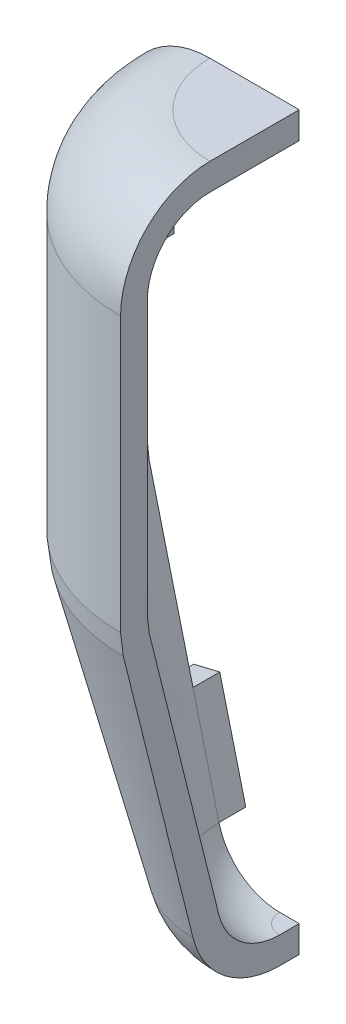
ISO-10303-21;
HEADER;
FILE_DESCRIPTION(('STEP AP214'),'2;1');
FILE_NAME('part.step','',(''),(''),'','','');
FILE_SCHEMA(('AUTOMOTIVE_DESIGN { 1 0 10303 214 1 1 1 1 }'));
ENDSEC;
DATA;
#1=APPLICATION_CONTEXT('core data for automotive mechanical design processes');
#2=APPLICATION_PROTOCOL_DEFINITION('international standard','automotive_design',2000,#1);
#3=PRODUCT_CONTEXT('',#1,'mechanical');
#4=PRODUCT('Part','Part','',(#3));
#5=PRODUCT_RELATED_PRODUCT_CATEGORY('part','',(#4));
#6=PRODUCT_DEFINITION_FORMATION('','',#4);
#7=PRODUCT_DEFINITION_CONTEXT('part definition',#1,'design');
#8=PRODUCT_DEFINITION('design','',#6,#7);
#9=PRODUCT_DEFINITION_SHAPE('','',#8);
#10=(LENGTH_UNIT() NAMED_UNIT(*) SI_UNIT(.MILLI.,.METRE.));
#11=(NAMED_UNIT(*) PLANE_ANGLE_UNIT() SI_UNIT($,.RADIAN.));
#12=(NAMED_UNIT(*) SI_UNIT($,.STERADIAN.) SOLID_ANGLE_UNIT());
#13=UNCERTAINTY_MEASURE_WITH_UNIT(LENGTH_MEASURE(1.E-05),#10,'distance_accuracy_value','');
#14=(GEOMETRIC_REPRESENTATION_CONTEXT(3) GLOBAL_UNCERTAINTY_ASSIGNED_CONTEXT((#13)) GLOBAL_UNIT_ASSIGNED_CONTEXT((#10,
#11,#12)) REPRESENTATION_CONTEXT('',''));
#15=CARTESIAN_POINT('',(0.,0.,0.));
#16=DIRECTION('',(0.,0.,1.));
#17=DIRECTION('',(1.,0.,0.));
#18=AXIS2_PLACEMENT_3D('',#15,#16,#17);
#19=CARTESIAN_POINT('',(-53.9,30.95,0.));
#20=DIRECTION('',(0.,0.,1.));
#21=DIRECTION('',(1.,0.,0.));
#22=AXIS2_PLACEMENT_3D('',#19,#20,#21);
#23=PLANE('',#22);
#24=DIRECTION('',(-1.,0.,0.));
#25=VECTOR('',#24,1.);
#26=CARTESIAN_POINT('',(0.,18.95,0.));
#27=LINE('',#26,#25);
#28=CARTESIAN_POINT('',(-60.9,18.95,0.));
#29=VERTEX_POINT('',#28);
#30=CARTESIAN_POINT('',(-63.9,18.95,0.));
#31=VERTEX_POINT('',#30);
#32=EDGE_CURVE('E181',#29,#31,#27,.T.);
#33=ORIENTED_EDGE('',*,*,#32,.F.);
#34=DIRECTION('',(0.,1.,0.));
#35=VECTOR('',#34,1.);
#36=CARTESIAN_POINT('',(-60.9,30.9500000000001,0.));
#37=LINE('',#36,#35);
#38=CARTESIAN_POINT('',(-60.9,0.281056256176644,0.));
#39=VERTEX_POINT('',#38);
#40=EDGE_CURVE('E281',#39,#29,#37,.T.);
#41=ORIENTED_EDGE('',*,*,#40,.F.);
#42=DIRECTION('',(-0.12218326369579,0.992507556682893,0.));
#43=VECTOR('',#42,1.);
#44=CARTESIAN_POINT('',(-60.9,0.281056256176644,0.));
#45=LINE('',#44,#43);
#46=CARTESIAN_POINT('',(-60.6909975010172,-1.41669311907765,0.));
#47=VERTEX_POINT('',#46);
#48=EDGE_CURVE('E279',#47,#39,#45,.T.);
#49=ORIENTED_EDGE('',*,*,#48,.F.);
#50=DIRECTION('',(-0.242535625036333,0.970142500145332,0.));
#51=VECTOR('',#50,1.);
#52=CARTESIAN_POINT('',(-52.883233436973,-32.6477493752543,0.));
#53=LINE('',#52,#51);
#54=CARTESIAN_POINT('',(-55.7936609374092,-21.0060393735097,0.));
#55=VERTEX_POINT('',#54);
#56=EDGE_CURVE('E275',#55,#47,#53,.T.);
#57=ORIENTED_EDGE('',*,*,#56,.F.);
#58=DIRECTION('',(-0.972615925793551,-0.232418288636575,0.));
#59=VECTOR('',#58,1.);
#60=CARTESIAN_POINT('',(1.73461699866961,-7.25896455031711,0.));
#61=LINE('',#60,#59);
#62=CARTESIAN_POINT('',(-58.7116669850018,-21.7033320599926,0.));
#63=VERTEX_POINT('',#62);
#64=EDGE_CURVE('E216',#55,#63,#61,.T.);
#65=ORIENTED_EDGE('',*,*,#64,.T.);
#66=DIRECTION('',(0.242535625036333,-0.970142500145332,0.));
#67=VECTOR('',#66,1.);
#68=CARTESIAN_POINT('',(-55.7936609374092,-33.3753562503633,0.));
#69=LINE('',#68,#67);
#70=CARTESIAN_POINT('',(-63.6014250014533,-2.14429999418669,0.));
#71=VERTEX_POINT('',#70);
#72=EDGE_CURVE('E260',#71,#63,#69,.T.);
#73=ORIENTED_EDGE('',*,*,#72,.F.);
#74=DIRECTION('',(0.122183263695706,-0.992507556682903,0.));
#75=VECTOR('',#74,1.);
#76=CARTESIAN_POINT('',(-63.6014250014533,-2.14429999418669,0.));
#77=LINE('',#76,#75);
#78=CARTESIAN_POINT('',(-63.9,0.281056256176644,0.));
#79=VERTEX_POINT('',#78);
#80=EDGE_CURVE('E257',#79,#71,#77,.T.);
#81=ORIENTED_EDGE('',*,*,#80,.F.);
#82=DIRECTION('',(0.,-1.,0.));
#83=VECTOR('',#82,1.);
#84=CARTESIAN_POINT('',(-63.9,0.281056256176644,0.));
#85=LINE('',#84,#83);
#86=EDGE_CURVE('E253',#31,#79,#85,.T.);
#87=ORIENTED_EDGE('',*,*,#86,.F.);
#88=EDGE_LOOP('',(#33,#41,#49,#57,#65,#73,#81,#87));
#89=FACE_BOUND('',#88,.T.);
#90=ADVANCED_FACE('F36',(#89),#23,.F.);
#91=CARTESIAN_POINT('',(-53.9,30.95,0.));
#92=DIRECTION('',(0.,0.,-1.));
#93=DIRECTION('',(1.,0.,0.));
#94=AXIS2_PLACEMENT_3D('',#91,#92,#93);
#95=CIRCLE('',#94,7.);
#96=CARTESIAN_POINT('',(-60.9,30.9500000000001,0.));
#97=VERTEX_POINT('',#96);
#98=CARTESIAN_POINT('',(-53.8999999999999,37.95,0.));
#99=VERTEX_POINT('',#98);
#100=EDGE_CURVE('E236',#97,#99,#95,.T.);
#101=ORIENTED_EDGE('',*,*,#100,.F.);
#102=DIRECTION('',(-1.,0.,0.));
#103=VECTOR('',#102,1.);
#104=CARTESIAN_POINT('',(0.,30.9499999999999,0.));
#105=LINE('',#104,#103);
#106=CARTESIAN_POINT('',(-63.9,30.95,0.));
#107=VERTEX_POINT('',#106);
#108=EDGE_CURVE('E185',#97,#107,#105,.T.);
#109=ORIENTED_EDGE('',*,*,#108,.T.);
#110=CARTESIAN_POINT('',(-53.9,30.95,0.));
#111=DIRECTION('',(0.,0.,1.));
#112=DIRECTION('',(-1.,0.,0.));
#113=AXIS2_PLACEMENT_3D('',#110,#111,#112);
#114=CIRCLE('',#113,10.);
#115=CARTESIAN_POINT('',(-53.9,40.95,0.));
#116=VERTEX_POINT('',#115);
#117=EDGE_CURVE('E250',#116,#107,#114,.T.);
#118=ORIENTED_EDGE('',*,*,#117,.F.);
#119=DIRECTION('',(-1.,0.,0.));
#120=VECTOR('',#119,1.);
#121=CARTESIAN_POINT('',(-53.9,40.95,0.));
#122=LINE('',#121,#120);
#123=CARTESIAN_POINT('',(-43.9,40.95,0.));
#124=VERTEX_POINT('',#123);
#125=EDGE_CURVE('E247',#124,#116,#122,.T.);
#126=ORIENTED_EDGE('',*,*,#125,.F.);
#127=DIRECTION('',(0.,1.,0.));
#128=VECTOR('',#127,1.);
#129=CARTESIAN_POINT('',(-43.9,40.95,0.));
#130=LINE('',#129,#128);
#131=CARTESIAN_POINT('',(-43.9,37.95,0.));
#132=VERTEX_POINT('',#131);
#133=EDGE_CURVE('E290',#132,#124,#130,.T.);
#134=ORIENTED_EDGE('',*,*,#133,.F.);
#135=DIRECTION('',(1.,0.,0.));
#136=VECTOR('',#135,1.);
#137=CARTESIAN_POINT('',(-43.9,37.95,0.));
#138=LINE('',#137,#136);
#139=EDGE_CURVE('E244',#99,#132,#138,.T.);
#140=ORIENTED_EDGE('',*,*,#139,.F.);
#141=EDGE_LOOP('',(#101,#109,#118,#126,#134,#140));
#142=FACE_BOUND('',#141,.T.);
#143=ADVANCED_FACE('F362',(#142),#23,.F.);
#144=CARTESIAN_POINT('',(-43.9,30.95,0.));
#145=DIRECTION('',(0.,-1.,0.));
#146=DIRECTION('',(0.,0.,-1.));
#147=AXIS2_PLACEMENT_3D('',#144,#145,#146);
#148=TOROIDAL_SURFACE('',#147,10.,7.);
#149=CARTESIAN_POINT('',(-43.9,37.95,0.));
#150=DIRECTION('',(0.,-1.,0.));
#151=DIRECTION('',(0.,0.,-1.));
#152=AXIS2_PLACEMENT_3D('',#149,#150,#151);
#153=CIRCLE('',#152,9.9999999999999);
#154=CARTESIAN_POINT('',(-43.9,37.95,9.9999999999999));
#155=VERTEX_POINT('',#154);
#156=EDGE_CURVE('E11',#155,#99,#153,.T.);
#157=ORIENTED_EDGE('',*,*,#156,.F.);
#158=CARTESIAN_POINT('',(-43.9,30.95,10.));
#159=DIRECTION('',(-1.,0.,0.));
#160=DIRECTION('',(0.,0.,-1.));
#161=AXIS2_PLACEMENT_3D('',#158,#159,#160);
#162=CIRCLE('',#161,7.);
#163=CARTESIAN_POINT('',(-43.8999999999999,30.9500000000001,17.));
#164=VERTEX_POINT('',#163);
#165=EDGE_CURVE('E284',#164,#155,#162,.T.);
#166=ORIENTED_EDGE('',*,*,#165,.F.);
#167=CARTESIAN_POINT('',(-43.9,30.9500000000001,0.));
#168=DIRECTION('',(0.,-1.,0.));
#169=DIRECTION('',(0.,0.,-1.));
#170=AXIS2_PLACEMENT_3D('',#167,#168,#169);
#171=CIRCLE('',#170,17.);
#172=EDGE_CURVE('E51',#164,#97,#171,.T.);
#173=ORIENTED_EDGE('',*,*,#172,.T.);
#174=ORIENTED_EDGE('',*,*,#100,.T.);
#175=EDGE_LOOP('',(#157,#166,#173,#174));
#176=FACE_BOUND('',#175,.T.);
#177=ADVANCED_FACE('F375',(#176),#148,.F.);
#178=CARTESIAN_POINT('',(-43.9,37.95,0.));
#179=DIRECTION('',(0.,1.,0.));
#180=DIRECTION('',(0.,0.,1.));
#181=AXIS2_PLACEMENT_3D('',#178,#179,#180);
#182=PLANE('',#181);
#183=ORIENTED_EDGE('',*,*,#139,.T.);
#184=DIRECTION('',(0.,0.,-1.));
#185=VECTOR('',#184,1.);
#186=CARTESIAN_POINT('',(-43.9,37.95,0.));
#187=LINE('',#186,#185);
#188=EDGE_CURVE('E287',#155,#132,#187,.T.);
#189=ORIENTED_EDGE('',*,*,#188,.F.);
#190=ORIENTED_EDGE('',*,*,#156,.T.);
#191=EDGE_LOOP('',(#183,#189,#190));
#192=FACE_BOUND('',#191,.T.);
#193=ADVANCED_FACE('F38',(#192),#182,.F.);
#194=CARTESIAN_POINT('',(-43.9,40.95,10.));
#195=DIRECTION('',(0.,-1.,0.));
#196=DIRECTION('',(0.,0.,-1.));
#197=AXIS2_PLACEMENT_3D('',#194,#195,#196);
#198=PLANE('',#197);
#199=CARTESIAN_POINT('',(-43.9,40.95,0.));
#200=DIRECTION('',(0.,-1.,0.));
#201=DIRECTION('',(0.,0.,-1.));
#202=AXIS2_PLACEMENT_3D('',#199,#200,#201);
#203=CIRCLE('',#202,10.);
#204=CARTESIAN_POINT('',(-43.9,40.95,10.));
#205=VERTEX_POINT('',#204);
#206=EDGE_CURVE('E44',#205,#116,#203,.T.);
#207=ORIENTED_EDGE('',*,*,#206,.F.);
#208=DIRECTION('',(0.,0.,1.));
#209=VECTOR('',#208,1.);
#210=CARTESIAN_POINT('',(-43.9,40.95,10.));
#211=LINE('',#210,#209);
#212=EDGE_CURVE('E293',#124,#205,#211,.T.);
#213=ORIENTED_EDGE('',*,*,#212,.F.);
#214=ORIENTED_EDGE('',*,*,#125,.T.);
#215=EDGE_LOOP('',(#207,#213,#214));
#216=FACE_BOUND('',#215,.T.);
#217=ADVANCED_FACE('F358',(#216),#198,.F.);
#218=CARTESIAN_POINT('',(-43.9,30.95,0.));
#219=DIRECTION('',(0.,-1.,0.));
#220=DIRECTION('',(0.,0.,-1.));
#221=AXIS2_PLACEMENT_3D('',#218,#219,#220);
#222=DEGENERATE_TOROIDAL_SURFACE('',#221,10.,10.,.T.);
#223=CARTESIAN_POINT('',(-43.9,30.9499999999999,0.));
#224=DIRECTION('',(0.,-1.,0.));
#225=DIRECTION('',(0.,0.,-1.));
#226=AXIS2_PLACEMENT_3D('',#223,#224,#225);
#227=CIRCLE('',#226,20.);
#228=CARTESIAN_POINT('',(-43.8999999999999,30.9499999999999,20.));
#229=VERTEX_POINT('',#228);
#230=EDGE_CURVE('E350',#229,#107,#227,.T.);
#231=ORIENTED_EDGE('',*,*,#230,.F.);
#232=CARTESIAN_POINT('',(-43.9,30.95,10.));
#233=DIRECTION('',(1.,0.,0.));
#234=DIRECTION('',(0.,0.,1.));
#235=AXIS2_PLACEMENT_3D('',#232,#233,#234);
#236=CIRCLE('',#235,10.);
#237=EDGE_CURVE('E296',#205,#229,#236,.T.);
#238=ORIENTED_EDGE('',*,*,#237,.F.);
#239=ORIENTED_EDGE('',*,*,#206,.T.);
#240=ORIENTED_EDGE('',*,*,#117,.T.);
#241=EDGE_LOOP('',(#231,#238,#239,#240));
#242=FACE_BOUND('',#241,.T.);
#243=ADVANCED_FACE('F354',(#242),#222,.T.);
#244=CARTESIAN_POINT('',(-43.9,40.95,0.));
#245=DIRECTION('',(0.,-1.,0.));
#246=DIRECTION('',(0.,0.,-1.));
#247=AXIS2_PLACEMENT_3D('',#244,#245,#246);
#248=CYLINDRICAL_SURFACE('',#247,20.);
#249=CARTESIAN_POINT('',(-43.9,0.281056256176644,0.));
#250=DIRECTION('',(0.,-1.,0.));
#251=DIRECTION('',(0.,0.,-1.));
#252=AXIS2_PLACEMENT_3D('',#249,#250,#251);
#253=CIRCLE('',#252,20.);
#254=CARTESIAN_POINT('',(-43.8999999999999,0.281056256176644,20.));
#255=VERTEX_POINT('',#254);
#256=EDGE_CURVE('E347',#255,#79,#253,.T.);
#257=ORIENTED_EDGE('',*,*,#256,.F.);
#258=DIRECTION('',(0.,-1.,0.));
#259=VECTOR('',#258,1.);
#260=CARTESIAN_POINT('',(-43.8999999999999,0.281056256176644,20.));
#261=LINE('',#260,#259);
#262=EDGE_CURVE('E299',#229,#255,#261,.T.);
#263=ORIENTED_EDGE('',*,*,#262,.F.);
#264=ORIENTED_EDGE('',*,*,#230,.T.);
#265=EDGE_CURVE('E254',#107,#31,#85,.T.);
#266=ORIENTED_EDGE('',*,*,#265,.T.);
#267=ORIENTED_EDGE('',*,*,#86,.T.);
#268=EDGE_LOOP('',(#257,#263,#264,#266,#267));
#269=FACE_BOUND('',#268,.T.);
#270=ADVANCED_FACE('F368',(#269),#248,.T.);
#271=CARTESIAN_POINT('',(-43.9,0.281056256176644,0.));
#272=DIRECTION('',(0.,1.,0.));
#273=DIRECTION('',(0.,0.,1.));
#274=AXIS2_PLACEMENT_3D('',#271,#272,#273);
#275=CONICAL_SURFACE('',#274,20.,0.122489331563434);
#276=CARTESIAN_POINT('',(-43.9,-2.14429999418669,0.));
#277=DIRECTION('',(0.,-1.,0.));
#278=DIRECTION('',(0.,0.,-1.));
#279=AXIS2_PLACEMENT_3D('',#276,#277,#278);
#280=CIRCLE('',#279,19.7014250014533);
#281=CARTESIAN_POINT('',(-43.8999999999999,-2.14429999418669,19.7014250014533));
#282=VERTEX_POINT('',#281);
#283=EDGE_CURVE('E345',#282,#71,#280,.T.);
#284=ORIENTED_EDGE('',*,*,#283,.F.);
#285=DIRECTION('',(0.,-0.992507556682903,-0.122183263695706));
#286=VECTOR('',#285,1.);
#287=CARTESIAN_POINT('',(-43.8999999999999,-2.14429999418669,19.7014250014533));
#288=LINE('',#287,#286);
#289=EDGE_CURVE('E302',#255,#282,#288,.T.);
#290=ORIENTED_EDGE('',*,*,#289,.F.);
#291=ORIENTED_EDGE('',*,*,#256,.T.);
#292=ORIENTED_EDGE('',*,*,#80,.T.);
#293=EDGE_LOOP('',(#284,#290,#291,#292));
#294=FACE_BOUND('',#293,.T.);
#295=ADVANCED_FACE('F431',(#294),#275,.T.);
#296=CARTESIAN_POINT('',(-43.9,-2.14429999418669,0.));
#297=DIRECTION('',(0.,1.,0.));
#298=DIRECTION('',(0.,0.,1.));
#299=AXIS2_PLACEMENT_3D('',#296,#297,#298);
#300=CONICAL_SURFACE('',#299,19.7014250014533,0.244978663126864);
#301=CARTESIAN_POINT('',(-43.9,-33.3753562503633,0.));
#302=DIRECTION('',(0.,-1.,0.));
#303=DIRECTION('',(0.,0.,-1.));
#304=AXIS2_PLACEMENT_3D('',#301,#302,#303);
#305=CIRCLE('',#304,11.8936609374092);
#306=CARTESIAN_POINT('',(-43.9,-33.3753562503633,11.8936609374092));
#307=VERTEX_POINT('',#306);
#308=CARTESIAN_POINT('',(-55.7936609374092,-33.3753562503633,0.));
#309=VERTEX_POINT('',#308);
#310=EDGE_CURVE('E342',#307,#309,#305,.T.);
#311=ORIENTED_EDGE('',*,*,#310,.F.);
#312=DIRECTION('',(0.,-0.970142500145332,-0.242535625036333));
#313=VECTOR('',#312,1.);
#314=CARTESIAN_POINT('',(-43.9,-33.3753562503633,11.8936609374092));
#315=LINE('',#314,#313);
#316=EDGE_CURVE('E305',#282,#307,#315,.T.);
#317=ORIENTED_EDGE('',*,*,#316,.F.);
#318=ORIENTED_EDGE('',*,*,#283,.T.);
#319=ORIENTED_EDGE('',*,*,#72,.T.);
#320=DIRECTION('',(-0.242535625036333,0.970142500145332,0.));
#321=VECTOR('',#320,1.);
#322=CARTESIAN_POINT('',(-60.3647058823529,-15.0911764705882,0.));
#323=LINE('',#322,#321);
#324=EDGE_CURVE('E213',#309,#63,#323,.T.);
#325=ORIENTED_EDGE('',*,*,#324,.F.);
#326=EDGE_LOOP('',(#311,#317,#318,#319,#325));
#327=FACE_BOUND('',#326,.T.);
#328=ADVANCED_FACE('F428',(#327),#300,.T.);
#329=CARTESIAN_POINT('',(-43.9,-30.95,0.));
#330=DIRECTION('',(0.,-1.,0.));
#331=DIRECTION('',(0.,0.,-1.));
#332=AXIS2_PLACEMENT_3D('',#329,#330,#331);
#333=DEGENERATE_TOROIDAL_SURFACE('',#332,2.19223593595584,10.,.T.);
#334=CARTESIAN_POINT('',(-43.9,-40.95,0.));
#335=DIRECTION('',(0.,-1.,0.));
#336=DIRECTION('',(0.,0.,-1.));
#337=AXIS2_PLACEMENT_3D('',#334,#335,#336);
#338=CIRCLE('',#337,2.19223593595584);
#339=CARTESIAN_POINT('',(-43.9,-40.95,2.19223593595584));
#340=VERTEX_POINT('',#339);
#341=CARTESIAN_POINT('',(-46.0922359359558,-40.95,0.));
#342=VERTEX_POINT('',#341);
#343=EDGE_CURVE('E340',#340,#342,#338,.T.);
#344=ORIENTED_EDGE('',*,*,#343,.F.);
#345=CARTESIAN_POINT('',(-43.9,-30.95,2.19223593595584));
#346=DIRECTION('',(1.,0.,0.));
#347=DIRECTION('',(0.,0.,-1.));
#348=AXIS2_PLACEMENT_3D('',#345,#346,#347);
#349=CIRCLE('',#348,10.);
#350=EDGE_CURVE('E308',#307,#340,#349,.T.);
#351=ORIENTED_EDGE('',*,*,#350,.F.);
#352=ORIENTED_EDGE('',*,*,#310,.T.);
#353=CARTESIAN_POINT('',(-46.0922359359558,-30.95,0.));
#354=DIRECTION('',(0.,0.,1.));
#355=DIRECTION('',(1.,0.,0.));
#356=AXIS2_PLACEMENT_3D('',#353,#354,#355);
#357=CIRCLE('',#356,10.);
#358=EDGE_CURVE('E263',#309,#342,#357,.T.);
#359=ORIENTED_EDGE('',*,*,#358,.T.);
#360=EDGE_LOOP('',(#344,#351,#352,#359));
#361=FACE_BOUND('',#360,.T.);
#362=ADVANCED_FACE('F423',(#361),#333,.T.);
#363=CARTESIAN_POINT('',(-43.9,-40.95,0.));
#364=DIRECTION('',(0.,1.,0.));
#365=DIRECTION('',(0.,0.,1.));
#366=AXIS2_PLACEMENT_3D('',#363,#364,#365);
#367=PLANE('',#366);
#368=DIRECTION('',(1.,0.,0.));
#369=VECTOR('',#368,1.);
#370=CARTESIAN_POINT('',(-43.9,-40.95,0.));
#371=LINE('',#370,#369);
#372=CARTESIAN_POINT('',(-43.9,-40.95,0.));
#373=VERTEX_POINT('',#372);
#374=EDGE_CURVE('E266',#342,#373,#371,.T.);
#375=ORIENTED_EDGE('',*,*,#374,.T.);
#376=DIRECTION('',(0.,0.,-1.));
#377=VECTOR('',#376,1.);
#378=CARTESIAN_POINT('',(-43.9,-40.95,0.));
#379=LINE('',#378,#377);
#380=EDGE_CURVE('E311',#340,#373,#379,.T.);
#381=ORIENTED_EDGE('',*,*,#380,.F.);
#382=ORIENTED_EDGE('',*,*,#343,.T.);
#383=EDGE_LOOP('',(#375,#381,#382));
#384=FACE_BOUND('',#383,.T.);
#385=ADVANCED_FACE('F453',(#384),#367,.F.);
#386=CARTESIAN_POINT('',(-43.9,-37.95,0.));
#387=DIRECTION('',(0.,-1.,0.));
#388=DIRECTION('',(0.,0.,-1.));
#389=AXIS2_PLACEMENT_3D('',#386,#387,#388);
#390=PLANE('',#389);
#391=CARTESIAN_POINT('',(-43.9,-37.9499999999999,0.));
#392=DIRECTION('',(0.,-1.,0.));
#393=DIRECTION('',(0.,0.,-1.));
#394=AXIS2_PLACEMENT_3D('',#391,#392,#393);
#395=CIRCLE('',#394,2.19223593595584);
#396=CARTESIAN_POINT('',(-43.9,-37.9499999999999,2.19223593595584));
#397=VERTEX_POINT('',#396);
#398=CARTESIAN_POINT('',(-46.0922359359558,-37.9499999999999,0.));
#399=VERTEX_POINT('',#398);
#400=EDGE_CURVE('E338',#397,#399,#395,.T.);
#401=ORIENTED_EDGE('',*,*,#400,.F.);
#402=DIRECTION('',(0.,0.,1.));
#403=VECTOR('',#402,1.);
#404=CARTESIAN_POINT('',(-43.9,-37.95,0.));
#405=LINE('',#404,#403);
#406=CARTESIAN_POINT('',(-43.9,-37.95,0.));
#407=VERTEX_POINT('',#406);
#408=EDGE_CURVE('E317',#407,#397,#405,.T.);
#409=ORIENTED_EDGE('',*,*,#408,.F.);
#410=DIRECTION('',(-1.,0.,0.));
#411=VECTOR('',#410,1.);
#412=CARTESIAN_POINT('',(-43.9,-37.95,0.));
#413=LINE('',#412,#411);
#414=EDGE_CURVE('E269',#407,#399,#413,.T.);
#415=ORIENTED_EDGE('',*,*,#414,.T.);
#416=EDGE_LOOP('',(#401,#409,#415));
#417=FACE_BOUND('',#416,.T.);
#418=ADVANCED_FACE('F451',(#417),#390,.F.);
#419=CARTESIAN_POINT('',(-43.9,-30.95,0.));
#420=DIRECTION('',(0.,-1.,0.));
#421=DIRECTION('',(0.,0.,-1.));
#422=AXIS2_PLACEMENT_3D('',#419,#420,#421);
#423=DEGENERATE_TOROIDAL_SURFACE('',#422,2.19223593595584,6.99999999999992,.T.);
#424=CARTESIAN_POINT('',(-43.9,-32.6477493752543,0.));
#425=DIRECTION('',(0.,-1.,0.));
#426=DIRECTION('',(0.,0.,-1.));
#427=AXIS2_PLACEMENT_3D('',#424,#425,#426);
#428=CIRCLE('',#427,8.98323343697302);
#429=CARTESIAN_POINT('',(-43.9,-32.6477493752543,8.98323343697302));
#430=VERTEX_POINT('',#429);
#431=CARTESIAN_POINT('',(-52.883233436973,-32.6477493752543,0.));
#432=VERTEX_POINT('',#431);
#433=EDGE_CURVE('E335',#430,#432,#428,.T.);
#434=ORIENTED_EDGE('',*,*,#433,.F.);
#435=CARTESIAN_POINT('',(-43.9,-30.95,2.19223593595584));
#436=DIRECTION('',(-1.,0.,0.));
#437=DIRECTION('',(0.,0.,1.));
#438=AXIS2_PLACEMENT_3D('',#435,#436,#437);
#439=CIRCLE('',#438,6.99999999999992);
#440=EDGE_CURVE('E320',#397,#430,#439,.T.);
#441=ORIENTED_EDGE('',*,*,#440,.F.);
#442=ORIENTED_EDGE('',*,*,#400,.T.);
#443=CARTESIAN_POINT('',(-46.0922359359558,-30.95,0.));
#444=DIRECTION('',(0.,0.,-1.));
#445=DIRECTION('',(-1.,0.,0.));
#446=AXIS2_PLACEMENT_3D('',#443,#444,#445);
#447=CIRCLE('',#446,6.99999999999992);
#448=EDGE_CURVE('E272',#399,#432,#447,.T.);
#449=ORIENTED_EDGE('',*,*,#448,.T.);
#450=EDGE_LOOP('',(#434,#441,#442,#449));
#451=FACE_BOUND('',#450,.T.);
#452=ADVANCED_FACE('F448',(#451),#423,.F.);
#453=CARTESIAN_POINT('',(-43.9,-21.0060393735103,0.));
#454=DIRECTION('',(0.,1.,0.));
#455=DIRECTION('',(0.,0.,1.));
#456=AXIS2_PLACEMENT_3D('',#453,#454,#455);
#457=CONICAL_SURFACE('',#456,11.893660937409,0.244978663126864);
#458=CARTESIAN_POINT('',(-43.9,-1.41669311907765,0.));
#459=DIRECTION('',(0.,-1.,0.));
#460=DIRECTION('',(0.,0.,-1.));
#461=AXIS2_PLACEMENT_3D('',#458,#459,#460);
#462=CIRCLE('',#461,16.7909975010172);
#463=CARTESIAN_POINT('',(-43.8999999999999,-1.41669311907765,16.7909975010172));
#464=VERTEX_POINT('',#463);
#465=EDGE_CURVE('E332',#464,#47,#462,.T.);
#466=ORIENTED_EDGE('',*,*,#465,.F.);
#467=DIRECTION('',(0.,0.970142500145332,0.242535625036333));
#468=VECTOR('',#467,1.);
#469=CARTESIAN_POINT('',(-43.9,-32.6477493752543,8.98323343697302));
#470=LINE('',#469,#468);
#471=EDGE_CURVE('E323',#430,#464,#470,.T.);
#472=ORIENTED_EDGE('',*,*,#471,.F.);
#473=ORIENTED_EDGE('',*,*,#433,.T.);
#474=EDGE_CURVE('E276',#432,#55,#53,.T.);
#475=ORIENTED_EDGE('',*,*,#474,.T.);
#476=ORIENTED_EDGE('',*,*,#56,.T.);
#477=EDGE_LOOP('',(#466,#472,#473,#475,#476));
#478=FACE_BOUND('',#477,.T.);
#479=ADVANCED_FACE('F444',(#478),#457,.F.);
#480=CARTESIAN_POINT('',(-43.9,-1.41669311907765,0.));
#481=DIRECTION('',(0.,1.,0.));
#482=DIRECTION('',(0.,0.,1.));
#483=AXIS2_PLACEMENT_3D('',#480,#481,#482);
#484=CONICAL_SURFACE('',#483,16.7909975010172,0.122489331563518);
#485=CARTESIAN_POINT('',(-43.9,0.281056256176644,0.));
#486=DIRECTION('',(0.,-1.,0.));
#487=DIRECTION('',(0.,0.,-1.));
#488=AXIS2_PLACEMENT_3D('',#485,#486,#487);
#489=CIRCLE('',#488,17.);
#490=CARTESIAN_POINT('',(-43.8999999999999,0.281056256176644,17.));
#491=VERTEX_POINT('',#490);
#492=EDGE_CURVE('E59',#491,#39,#489,.T.);
#493=ORIENTED_EDGE('',*,*,#492,.F.);
#494=DIRECTION('',(0.,0.992507556682893,0.12218326369579));
#495=VECTOR('',#494,1.);
#496=CARTESIAN_POINT('',(-43.8999999999999,0.281056256176644,17.));
#497=LINE('',#496,#495);
#498=EDGE_CURVE('E325',#464,#491,#497,.T.);
#499=ORIENTED_EDGE('',*,*,#498,.F.);
#500=ORIENTED_EDGE('',*,*,#465,.T.);
#501=ORIENTED_EDGE('',*,*,#48,.T.);
#502=EDGE_LOOP('',(#493,#499,#500,#501));
#503=FACE_BOUND('',#502,.T.);
#504=ADVANCED_FACE('F379',(#503),#484,.F.);
#505=CARTESIAN_POINT('',(-43.9,40.95,0.));
#506=DIRECTION('',(0.,-1.,0.));
#507=DIRECTION('',(0.,0.,-1.));
#508=AXIS2_PLACEMENT_3D('',#505,#506,#507);
#509=CYLINDRICAL_SURFACE('',#508,17.);
#510=DIRECTION('',(0.,1.,0.));
#511=VECTOR('',#510,1.);
#512=CARTESIAN_POINT('',(-43.8999999999999,30.9500000000001,17.));
#513=LINE('',#512,#511);
#514=EDGE_CURVE('E327',#491,#164,#513,.T.);
#515=ORIENTED_EDGE('',*,*,#514,.F.);
#516=ORIENTED_EDGE('',*,*,#492,.T.);
#517=ORIENTED_EDGE('',*,*,#40,.T.);
#518=DIRECTION('',(0.,-1.,0.));
#519=VECTOR('',#518,1.);
#520=CARTESIAN_POINT('',(-60.9,0.,0.));
#521=LINE('',#520,#519);
#522=EDGE_CURVE('E209',#97,#29,#521,.T.);
#523=ORIENTED_EDGE('',*,*,#522,.F.);
#524=ORIENTED_EDGE('',*,*,#172,.F.);
#525=EDGE_LOOP('',(#515,#516,#517,#523,#524));
#526=FACE_BOUND('',#525,.T.);
#527=ADVANCED_FACE('F376',(#526),#509,.F.);
#528=CARTESIAN_POINT('',(-43.9,30.95,10.));
#529=DIRECTION('',(1.,0.,0.));
#530=DIRECTION('',(0.,0.,-1.));
#531=AXIS2_PLACEMENT_3D('',#528,#529,#530);
#532=PLANE('',#531);
#533=ORIENTED_EDGE('',*,*,#165,.T.);
#534=ORIENTED_EDGE('',*,*,#188,.T.);
#535=ORIENTED_EDGE('',*,*,#133,.T.);
#536=ORIENTED_EDGE('',*,*,#212,.T.);
#537=ORIENTED_EDGE('',*,*,#237,.T.);
#538=ORIENTED_EDGE('',*,*,#262,.T.);
#539=ORIENTED_EDGE('',*,*,#289,.T.);
#540=ORIENTED_EDGE('',*,*,#316,.T.);
#541=ORIENTED_EDGE('',*,*,#350,.T.);
#542=ORIENTED_EDGE('',*,*,#380,.T.);
#543=DIRECTION('',(0.,1.,0.));
#544=VECTOR('',#543,1.);
#545=CARTESIAN_POINT('',(-43.9,-40.95,0.));
#546=LINE('',#545,#544);
#547=EDGE_CURVE('E314',#373,#407,#546,.T.);
#548=ORIENTED_EDGE('',*,*,#547,.T.);
#549=ORIENTED_EDGE('',*,*,#408,.T.);
#550=ORIENTED_EDGE('',*,*,#440,.T.);
#551=ORIENTED_EDGE('',*,*,#471,.T.);
#552=ORIENTED_EDGE('',*,*,#498,.T.);
#553=ORIENTED_EDGE('',*,*,#514,.T.);
#554=EDGE_LOOP('',(#533,#534,#535,#536,#537,#538,#539,#540,#541,#542,#548,#549,#550,#551,#552,#553));
#555=FACE_BOUND('',#554,.T.);
#556=ADVANCED_FACE('F370',(#555),#532,.T.);
#557=ORIENTED_EDGE('',*,*,#358,.F.);
#558=DIRECTION('',(0.970142500145333,0.24253562503633,0.));
#559=VECTOR('',#558,1.);
#560=CARTESIAN_POINT('',(4.57104494494376,-18.2841797797753,0.));
#561=LINE('',#560,#559);
#562=EDGE_CURVE('E218',#309,#432,#561,.T.);
#563=ORIENTED_EDGE('',*,*,#562,.T.);
#564=ORIENTED_EDGE('',*,*,#448,.F.);
#565=ORIENTED_EDGE('',*,*,#414,.F.);
#566=ORIENTED_EDGE('',*,*,#547,.F.);
#567=ORIENTED_EDGE('',*,*,#374,.F.);
#568=EDGE_LOOP('',(#557,#563,#564,#565,#566,#567));
#569=FACE_BOUND('',#568,.T.);
#570=ADVANCED_FACE('F403',(#569),#23,.F.);
#571=CARTESIAN_POINT('',(1.73461699866961,-7.25896455031711,-16.6737206942296));
#572=DIRECTION('',(-0.232418288636575,0.97261592579355,0.));
#573=DIRECTION('',(-0.972615925793551,-0.232418288636576,0.));
#574=AXIS2_PLACEMENT_3D('',#571,#572,#573);
#575=PLANE('',#574);
#576=DIRECTION('',(0.,0.,1.));
#577=VECTOR('',#576,1.);
#578=CARTESIAN_POINT('',(-55.7936609374092,-21.0060393735097,-16.6737206942296));
#579=LINE('',#578,#577);
#580=CARTESIAN_POINT('',(-55.7936609374092,-21.0060393735097,-3.));
#581=VERTEX_POINT('',#580);
#582=EDGE_CURVE('E227',#581,#55,#579,.T.);
#583=ORIENTED_EDGE('',*,*,#582,.F.);
#584=DIRECTION('',(-0.972615925793551,-0.232418288636576,0.));
#585=VECTOR('',#584,1.);
#586=CARTESIAN_POINT('',(1.73461699866961,-7.25896455031711,-3.));
#587=LINE('',#586,#585);
#588=CARTESIAN_POINT('',(-58.7116669850018,-21.7033320599926,-3.));
#589=VERTEX_POINT('',#588);
#590=EDGE_CURVE('E194',#581,#589,#587,.T.);
#591=ORIENTED_EDGE('',*,*,#590,.T.);
#592=DIRECTION('',(0.,0.,1.));
#593=VECTOR('',#592,1.);
#594=CARTESIAN_POINT('',(-58.7116669850018,-21.7033320599926,-16.6737206942296));
#595=LINE('',#594,#593);
#596=EDGE_CURVE('E233',#589,#63,#595,.T.);
#597=ORIENTED_EDGE('',*,*,#596,.T.);
#598=ORIENTED_EDGE('',*,*,#64,.F.);
#599=EDGE_LOOP('',(#583,#591,#597,#598));
#600=FACE_BOUND('',#599,.T.);
#601=ADVANCED_FACE('F409',(#600),#575,.T.);
#602=CARTESIAN_POINT('',(-57.4542783819168,-14.3635695954792,-16.6737206942296));
#603=DIRECTION('',(-0.970142500145332,-0.242535625036333,0.));
#604=DIRECTION('',(0.242535625036333,-0.970142500145332,0.));
#605=AXIS2_PLACEMENT_3D('',#602,#603,#604);
#606=PLANE('',#605);
#607=DIRECTION('',(0.242535625036333,-0.970142500145332,0.));
#608=VECTOR('',#607,1.);
#609=CARTESIAN_POINT('',(-57.4542783819168,-14.3635695954792,-3.));
#610=LINE('',#609,#608);
#611=CARTESIAN_POINT('',(-52.8832334369731,-32.6477493752543,-3.));
#612=VERTEX_POINT('',#611);
#613=EDGE_CURVE('E221',#581,#612,#610,.T.);
#614=ORIENTED_EDGE('',*,*,#613,.F.);
#615=ORIENTED_EDGE('',*,*,#582,.T.);
#616=ORIENTED_EDGE('',*,*,#474,.F.);
#617=DIRECTION('',(0.,0.,1.));
#618=VECTOR('',#617,1.);
#619=CARTESIAN_POINT('',(-52.8832334369731,-32.6477493752543,-16.6737206942296));
#620=LINE('',#619,#618);
#621=EDGE_CURVE('E226',#612,#432,#620,.T.);
#622=ORIENTED_EDGE('',*,*,#621,.F.);
#623=EDGE_LOOP('',(#614,#615,#616,#622));
#624=FACE_BOUND('',#623,.T.);
#625=ADVANCED_FACE('F415',(#624),#606,.F.);
#626=CARTESIAN_POINT('',(4.57104494494376,-18.2841797797753,-16.6737206942296));
#627=DIRECTION('',(0.24253562503633,-0.970142500145333,0.));
#628=DIRECTION('',(0.970142500145333,0.24253562503633,0.));
#629=AXIS2_PLACEMENT_3D('',#626,#627,#628);
#630=PLANE('',#629);
#631=DIRECTION('',(0.,0.,1.));
#632=VECTOR('',#631,1.);
#633=CARTESIAN_POINT('',(-55.7936609374092,-33.3753562503633,-16.6737206942296));
#634=LINE('',#633,#632);
#635=CARTESIAN_POINT('',(-55.7936609374092,-33.3753562503633,-3.));
#636=VERTEX_POINT('',#635);
#637=EDGE_CURVE('E217',#636,#309,#634,.T.);
#638=ORIENTED_EDGE('',*,*,#637,.F.);
#639=DIRECTION('',(0.970142500145333,0.24253562503633,0.));
#640=VECTOR('',#639,1.);
#641=CARTESIAN_POINT('',(4.57104494494376,-18.2841797797753,-3.));
#642=LINE('',#641,#640);
#643=EDGE_CURVE('E224',#636,#612,#642,.T.);
#644=ORIENTED_EDGE('',*,*,#643,.T.);
#645=ORIENTED_EDGE('',*,*,#621,.T.);
#646=ORIENTED_EDGE('',*,*,#562,.F.);
#647=EDGE_LOOP('',(#638,#644,#645,#646));
#648=FACE_BOUND('',#647,.T.);
#649=ADVANCED_FACE('F440',(#648),#630,.T.);
#650=CARTESIAN_POINT('',(-60.3647058823529,-15.0911764705882,-16.6737206942296));
#651=DIRECTION('',(0.970142500145332,0.242535625036333,0.));
#652=DIRECTION('',(-0.242535625036333,0.970142500145332,0.));
#653=AXIS2_PLACEMENT_3D('',#650,#651,#652);
#654=PLANE('',#653);
#655=DIRECTION('',(-0.242535625036333,0.970142500145332,0.));
#656=VECTOR('',#655,1.);
#657=CARTESIAN_POINT('',(-60.3647058823529,-15.0911764705882,-3.));
#658=LINE('',#657,#656);
#659=EDGE_CURVE('E230',#636,#589,#658,.T.);
#660=ORIENTED_EDGE('',*,*,#659,.F.);
#661=ORIENTED_EDGE('',*,*,#637,.T.);
#662=ORIENTED_EDGE('',*,*,#324,.T.);
#663=ORIENTED_EDGE('',*,*,#596,.F.);
#664=EDGE_LOOP('',(#660,#661,#662,#663));
#665=FACE_BOUND('',#664,.T.);
#666=ADVANCED_FACE('F397',(#665),#654,.F.);
#667=CARTESIAN_POINT('',(0.,0.,-3.));
#668=DIRECTION('',(0.,0.,-1.));
#669=DIRECTION('',(0.,-1.,0.));
#670=AXIS2_PLACEMENT_3D('',#667,#668,#669);
#671=PLANE('',#670);
#672=ORIENTED_EDGE('',*,*,#590,.F.);
#673=ORIENTED_EDGE('',*,*,#613,.T.);
#674=ORIENTED_EDGE('',*,*,#643,.F.);
#675=ORIENTED_EDGE('',*,*,#659,.T.);
#676=EDGE_LOOP('',(#672,#673,#674,#675));
#677=FACE_BOUND('',#676,.T.);
#678=ADVANCED_FACE('F390',(#677),#671,.T.);
#679=CARTESIAN_POINT('',(0.,30.9499999999999,-16.6737206942296));
#680=DIRECTION('',(0.,1.,0.));
#681=DIRECTION('',(0.,0.,1.));
#682=AXIS2_PLACEMENT_3D('',#679,#680,#681);
#683=PLANE('',#682);
#684=DIRECTION('',(0.,0.,1.));
#685=VECTOR('',#684,1.);
#686=CARTESIAN_POINT('',(-60.9,30.9500000000001,-16.6737206942296));
#687=LINE('',#686,#685);
#688=CARTESIAN_POINT('',(-60.9,30.9500000000001,-3.));
#689=VERTEX_POINT('',#688);
#690=EDGE_CURVE('E206',#689,#97,#687,.T.);
#691=ORIENTED_EDGE('',*,*,#690,.F.);
#692=DIRECTION('',(-1.,0.,0.));
#693=VECTOR('',#692,1.);
#694=CARTESIAN_POINT('',(0.,30.9499999999999,-3.));
#695=LINE('',#694,#693);
#696=CARTESIAN_POINT('',(-63.9,30.95,-3.));
#697=VERTEX_POINT('',#696);
#698=EDGE_CURVE('E204',#689,#697,#695,.T.);
#699=ORIENTED_EDGE('',*,*,#698,.T.);
#700=DIRECTION('',(0.,0.,1.));
#701=VECTOR('',#700,1.);
#702=CARTESIAN_POINT('',(-63.9,30.95,-16.6737206942296));
#703=LINE('',#702,#701);
#704=EDGE_CURVE('E190',#697,#107,#703,.T.);
#705=ORIENTED_EDGE('',*,*,#704,.T.);
#706=ORIENTED_EDGE('',*,*,#108,.F.);
#707=EDGE_LOOP('',(#691,#699,#705,#706));
#708=FACE_BOUND('',#707,.T.);
#709=ADVANCED_FACE('F388',(#708),#683,.T.);
#710=CARTESIAN_POINT('',(-60.9,0.,-16.6737206942296));
#711=DIRECTION('',(-1.,0.,0.));
#712=DIRECTION('',(0.,0.,1.));
#713=AXIS2_PLACEMENT_3D('',#710,#711,#712);
#714=PLANE('',#713);
#715=DIRECTION('',(0.,-1.,0.));
#716=VECTOR('',#715,1.);
#717=CARTESIAN_POINT('',(-60.9,0.,-3.));
#718=LINE('',#717,#716);
#719=CARTESIAN_POINT('',(-60.9,18.95,-3.));
#720=VERTEX_POINT('',#719);
#721=EDGE_CURVE('E198',#689,#720,#718,.T.);
#722=ORIENTED_EDGE('',*,*,#721,.F.);
#723=ORIENTED_EDGE('',*,*,#690,.T.);
#724=ORIENTED_EDGE('',*,*,#522,.T.);
#725=DIRECTION('',(0.,0.,1.));
#726=VECTOR('',#725,1.);
#727=CARTESIAN_POINT('',(-60.9,18.95,-16.6737206942296));
#728=LINE('',#727,#726);
#729=EDGE_CURVE('E210',#720,#29,#728,.T.);
#730=ORIENTED_EDGE('',*,*,#729,.F.);
#731=EDGE_LOOP('',(#722,#723,#724,#730));
#732=FACE_BOUND('',#731,.T.);
#733=ADVANCED_FACE('F387',(#732),#714,.F.);
#734=CARTESIAN_POINT('',(0.,18.95,-16.6737206942296));
#735=DIRECTION('',(0.,1.,0.));
#736=DIRECTION('',(0.,0.,1.));
#737=AXIS2_PLACEMENT_3D('',#734,#735,#736);
#738=PLANE('',#737);
#739=DIRECTION('',(-1.,0.,0.));
#740=VECTOR('',#739,1.);
#741=CARTESIAN_POINT('',(0.,18.95,-3.));
#742=LINE('',#741,#740);
#743=CARTESIAN_POINT('',(-63.9,18.95,-3.));
#744=VERTEX_POINT('',#743);
#745=EDGE_CURVE('E178',#720,#744,#742,.T.);
#746=ORIENTED_EDGE('',*,*,#745,.F.);
#747=ORIENTED_EDGE('',*,*,#729,.T.);
#748=ORIENTED_EDGE('',*,*,#32,.T.);
#749=DIRECTION('',(0.,0.,1.));
#750=VECTOR('',#749,1.);
#751=CARTESIAN_POINT('',(-63.9,18.95,-16.6737206942296));
#752=LINE('',#751,#750);
#753=EDGE_CURVE('E174',#744,#31,#752,.T.);
#754=ORIENTED_EDGE('',*,*,#753,.F.);
#755=EDGE_LOOP('',(#746,#747,#748,#754));
#756=FACE_BOUND('',#755,.T.);
#757=ADVANCED_FACE('F176',(#756),#738,.F.);
#758=CARTESIAN_POINT('',(-63.9,0.,-16.6737206942296));
#759=DIRECTION('',(1.,0.,0.));
#760=DIRECTION('',(0.,0.,-1.));
#761=AXIS2_PLACEMENT_3D('',#758,#759,#760);
#762=PLANE('',#761);
#763=DIRECTION('',(0.,1.,0.));
#764=VECTOR('',#763,1.);
#765=CARTESIAN_POINT('',(-63.9,0.,-3.));
#766=LINE('',#765,#764);
#767=EDGE_CURVE('E188',#744,#697,#766,.T.);
#768=ORIENTED_EDGE('',*,*,#767,.F.);
#769=ORIENTED_EDGE('',*,*,#753,.T.);
#770=ORIENTED_EDGE('',*,*,#265,.F.);
#771=ORIENTED_EDGE('',*,*,#704,.F.);
#772=EDGE_LOOP('',(#768,#769,#770,#771));
#773=FACE_BOUND('',#772,.T.);
#774=ADVANCED_FACE('F189',(#773),#762,.F.);
#775=CARTESIAN_POINT('',(0.,0.,-3.));
#776=DIRECTION('',(0.,0.,-1.));
#777=DIRECTION('',(0.,-1.,0.));
#778=AXIS2_PLACEMENT_3D('',#775,#776,#777);
#779=PLANE('',#778);
#780=ORIENTED_EDGE('',*,*,#698,.F.);
#781=ORIENTED_EDGE('',*,*,#721,.T.);
#782=ORIENTED_EDGE('',*,*,#745,.T.);
#783=ORIENTED_EDGE('',*,*,#767,.T.);
#784=EDGE_LOOP('',(#780,#781,#782,#783));
#785=FACE_BOUND('',#784,.T.);
#786=ADVANCED_FACE('F197',(#785),#779,.T.);
#787=CLOSED_SHELL('',(#90,#143,#177,#193,#217,#243,#270,#295,#328,#362,#385,#418,#452,#479,#504,
#527,#556,#570,#601,#625,#649,#666,#678,#709,#733,#757,#774,#786));
#788=MANIFOLD_SOLID_BREP('B2',#787);
#789=ADVANCED_BREP_SHAPE_REPRESENTATION('',(#18,#788),#14);
#790=SHAPE_DEFINITION_REPRESENTATION(#9,#789);
ENDSEC;
END-ISO-10303-21;
